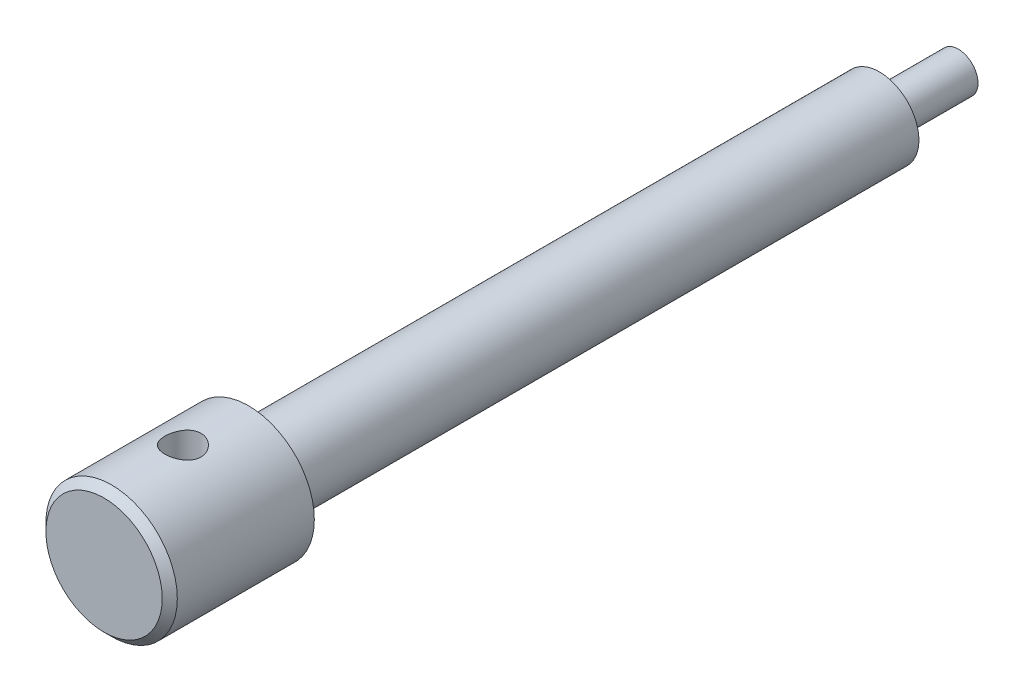
ISO-10303-21;
HEADER;
FILE_DESCRIPTION(('STEP AP214'),'2;1');
FILE_NAME('part.step','',(''),(''),'','','');
FILE_SCHEMA(('AUTOMOTIVE_DESIGN { 1 0 10303 214 1 1 1 1 }'));
ENDSEC;
DATA;
#1=APPLICATION_CONTEXT('core data for automotive mechanical design processes');
#2=APPLICATION_PROTOCOL_DEFINITION('international standard','automotive_design',2000,#1);
#3=PRODUCT_CONTEXT('',#1,'mechanical');
#4=PRODUCT('Part','Part','',(#3));
#5=PRODUCT_RELATED_PRODUCT_CATEGORY('part','',(#4));
#6=PRODUCT_DEFINITION_FORMATION('','',#4);
#7=PRODUCT_DEFINITION_CONTEXT('part definition',#1,'design');
#8=PRODUCT_DEFINITION('design','',#6,#7);
#9=PRODUCT_DEFINITION_SHAPE('','',#8);
#10=(LENGTH_UNIT() NAMED_UNIT(*) SI_UNIT(.MILLI.,.METRE.));
#11=(NAMED_UNIT(*) PLANE_ANGLE_UNIT() SI_UNIT($,.RADIAN.));
#12=(NAMED_UNIT(*) SI_UNIT($,.STERADIAN.) SOLID_ANGLE_UNIT());
#13=UNCERTAINTY_MEASURE_WITH_UNIT(LENGTH_MEASURE(1.E-05),#10,'distance_accuracy_value','');
#14=(GEOMETRIC_REPRESENTATION_CONTEXT(3) GLOBAL_UNCERTAINTY_ASSIGNED_CONTEXT((#13)) GLOBAL_UNIT_ASSIGNED_CONTEXT((#10,
#11,#12)) REPRESENTATION_CONTEXT('',''));
#15=CARTESIAN_POINT('',(0.,0.,0.));
#16=DIRECTION('',(0.,0.,1.));
#17=DIRECTION('',(1.,0.,0.));
#18=AXIS2_PLACEMENT_3D('',#15,#16,#17);
#19=CARTESIAN_POINT('',(0.,0.,-22.));
#20=DIRECTION('',(0.,0.,1.));
#21=DIRECTION('',(1.,0.,0.));
#22=AXIS2_PLACEMENT_3D('',#19,#20,#21);
#23=CYLINDRICAL_SURFACE('',#22,10.);
#24=CARTESIAN_POINT('',(0.,0.,-1.14999999999998));
#25=DIRECTION('',(0.,0.,1.));
#26=DIRECTION('',(1.,0.,0.));
#27=AXIS2_PLACEMENT_3D('',#24,#25,#26);
#28=CIRCLE('',#27,10.);
#29=CARTESIAN_POINT('',(10.,0.,-1.14999999999998));
#30=VERTEX_POINT('',#29);
#31=EDGE_CURVE('E10',#30,#30,#28,.F.);
#32=ORIENTED_EDGE('',*,*,#31,.T.);
#33=EDGE_LOOP('',(#32));
#34=FACE_BOUND('',#33,.T.);
#35=CARTESIAN_POINT('',(0.,-10.,-9.25));
#36=CARTESIAN_POINT('',(-0.15142288054616,-9.99999790513766,-9.25000321500592));
#37=CARTESIAN_POINT('',(-0.30287955595928,-9.99652704650772,-9.26254850145414));
#38=CARTESIAN_POINT('',(-0.601418354260669,-9.9830186270672,-9.31230216365556));
#39=CARTESIAN_POINT('',(-0.748498536656077,-9.97297819743096,-9.34952131418069));
#40=CARTESIAN_POINT('',(-1.03393279250043,-9.94743692261125,-9.44731247744151));
#41=CARTESIAN_POINT('',(-1.17229822737418,-9.93194336798913,-9.50785332037831));
#42=CARTESIAN_POINT('',(-1.43691255379179,-9.89712668345016,-9.65045078860279));
#43=CARTESIAN_POINT('',(-1.56316043555,-9.8778032347893,-9.73250920488028));
#44=CARTESIAN_POINT('',(-1.80305227968481,-9.83687707615023,-9.917936466711));
#45=CARTESIAN_POINT('',(-1.91635675585361,-9.81523348882718,-10.0217354929931));
#46=CARTESIAN_POINT('',(-2.12418937034499,-9.77236429681612,-10.2467786095008));
#47=CARTESIAN_POINT('',(-2.21871492536604,-9.75113874999667,-10.3680250959166));
#48=CARTESIAN_POINT('',(-2.3879928048007,-9.71108741535023,-10.6272699953001));
#49=CARTESIAN_POINT('',(-2.46234890182804,-9.69231302357291,-10.7655358044921));
#50=CARTESIAN_POINT('',(-2.58662289280498,-9.65989315157521,-11.0532068008113));
#51=CARTESIAN_POINT('',(-2.63654561269354,-9.64624665864575,-11.202609781466));
#52=CARTESIAN_POINT('',(-2.70934583339765,-9.62605068230367,-11.5045411062658));
#53=CARTESIAN_POINT('',(-2.73284141478253,-9.61933931887465,-11.6569093237221));
#54=CARTESIAN_POINT('',(-2.75404817777636,-9.61329031398856,-11.9635612268621));
#55=CARTESIAN_POINT('',(-2.75176451055439,-9.61395119941996,-12.1178445237233));
#56=CARTESIAN_POINT('',(-2.72196703105347,-9.62242747025718,-12.4190757478641));
#57=CARTESIAN_POINT('',(-2.69520726367137,-9.63002901969587,-12.5661052477844));
#58=CARTESIAN_POINT('',(-2.61842742838165,-9.65118687572159,-12.8535025714285));
#59=CARTESIAN_POINT('',(-2.56840539656606,-9.66474368507387,-12.9938698315922));
#60=CARTESIAN_POINT('',(-2.4459209567268,-9.6964683447985,-13.2658944108331));
#61=CARTESIAN_POINT('',(-2.37319900461751,-9.71468906347739,-13.3974284382204));
#62=CARTESIAN_POINT('',(-2.20755990360936,-9.75366083636266,-13.6466884827834));
#63=CARTESIAN_POINT('',(-2.11463855343105,-9.77441241656904,-13.7644116195729));
#64=CARTESIAN_POINT('',(-1.90740929772698,-9.81699239446061,-13.9870091466622));
#65=CARTESIAN_POINT('',(-1.79246989633679,-9.83883313993221,-14.0912941501466));
#66=CARTESIAN_POINT('',(-1.54646529022639,-9.88048509931731,-14.2792334861871));
#67=CARTESIAN_POINT('',(-1.41539936793062,-9.90029622284757,-14.3628869002094));
#68=CARTESIAN_POINT('',(-1.13991171237083,-9.93579173537182,-14.5074709694204));
#69=CARTESIAN_POINT('',(-0.99542816902353,-9.95145560173257,-14.5682892228292));
#70=CARTESIAN_POINT('',(-0.697756886739508,-9.97674362417589,-14.6645994988265));
#71=CARTESIAN_POINT('',(-0.544571183725094,-9.98636918666117,-14.7000974191275));
#72=CARTESIAN_POINT('',(-0.238869177115232,-9.9982810111614,-14.7438206524885));
#73=CARTESIAN_POINT('',(-0.0864756103297054,-10.000782674802,-14.7528466438887));
#74=CARTESIAN_POINT('',(0.217649807662516,-9.9987871538593,-14.7455888909791));
#75=CARTESIAN_POINT('',(0.369381730098336,-9.99429074228732,-14.7293079420889));
#76=CARTESIAN_POINT('',(0.664979617013325,-9.97894393202139,-14.6725532308625));
#77=CARTESIAN_POINT('',(0.808939039798371,-9.9682122412504,-14.6325311636914));
#78=CARTESIAN_POINT('',(1.0880827793532,-9.94161719611215,-14.5299593417987));
#79=CARTESIAN_POINT('',(1.22326611385297,-9.92575326850046,-14.4674070704807));
#80=CARTESIAN_POINT('',(1.48409215986275,-9.8901549618779,-14.3200996389175));
#81=CARTESIAN_POINT('',(1.60948250607276,-9.8703479114638,-14.2349156438466));
#82=CARTESIAN_POINT('',(1.84446827852135,-9.82915015297009,-14.0452974327971));
#83=CARTESIAN_POINT('',(1.95406037181207,-9.80775911215361,-13.9408591653165));
#84=CARTESIAN_POINT('',(2.15775026201618,-9.7650031873956,-13.7119525791631));
#85=CARTESIAN_POINT('',(2.251281730008,-9.74365851048396,-13.5869755682236));
#86=CARTESIAN_POINT('',(2.41606367483463,-9.70411480368906,-13.3226441444321));
#87=CARTESIAN_POINT('',(2.48731502634094,-9.68591565033158,-13.183290296271));
#88=CARTESIAN_POINT('',(2.60498194683926,-9.65493519387949,-12.8948127830444));
#89=CARTESIAN_POINT('',(2.65153712112234,-9.64212352305557,-12.7457495020344));
#90=CARTESIAN_POINT('',(2.71879365333576,-9.62337795912282,-12.4414941043237));
#91=CARTESIAN_POINT('',(2.73950213610858,-9.61744217065575,-12.2863036887896));
#92=CARTESIAN_POINT('',(2.75404886250929,-9.6132857915914,-11.9800168619441));
#93=CARTESIAN_POINT('',(2.7488002394832,-9.614803002412,-11.8289667485267));
#94=CARTESIAN_POINT('',(2.71371466404338,-9.62476380479946,-11.5299943066319));
#95=CARTESIAN_POINT('',(2.6838784224126,-9.63320719614311,-11.3820718878654));
#96=CARTESIAN_POINT('',(2.60100915929162,-9.65590796713358,-11.0947850377666));
#97=CARTESIAN_POINT('',(2.54818121034424,-9.67011387408798,-10.955357095575));
#98=CARTESIAN_POINT('',(2.4209868326845,-9.70273746413612,-10.6872356500162));
#99=CARTESIAN_POINT('',(2.34661683356165,-9.72115584530486,-10.5585439306439));
#100=CARTESIAN_POINT('',(2.17573113118099,-9.76084545820376,-10.31121804491));
#101=CARTESIAN_POINT('',(2.07859788342802,-9.78218767167194,-10.1930219082836));
#102=CARTESIAN_POINT('',(1.86610223089928,-9.82493707924126,-9.97431048146074));
#103=CARTESIAN_POINT('',(1.75073533607713,-9.84634428807069,-9.87379955917612));
#104=CARTESIAN_POINT('',(1.50182041708214,-9.88740569602886,-9.69101234570102));
#105=CARTESIAN_POINT('',(1.36791284853874,-9.907007737952,-9.60921290648396));
#106=CARTESIAN_POINT('',(1.08770978773099,-9.94166772298476,-9.46941355547849));
#107=CARTESIAN_POINT('',(0.941421808208406,-9.95672839694538,-9.41139933339713));
#108=CARTESIAN_POINT('',(0.663199431238339,-9.97880995779365,-9.3278272791417));
#109=CARTESIAN_POINT('',(0.532391527581486,-9.9866965174671,-9.29871242008099));
#110=CARTESIAN_POINT('',(0.267730991455101,-9.9972921723884,-9.25979844958546));
#111=CARTESIAN_POINT('',(0.13387870444774,-10.0000018521471,-9.24999715749148));
#112=CARTESIAN_POINT('',(0.,-10.,-9.25));
#113=B_SPLINE_CURVE_WITH_KNOTS('',3,(#35,#36,#37,#38,#39,#40,#41,#42,#43,#44,#45,#46,#47,#48,
#49,#50,#51,#52,#53,#54,#55,#56,#57,#58,#59,#60,#61,#62,#63,#64,#65,#66,#67,#68,#69,#70,#71,#72,
#73,#74,#75,#76,#77,#78,#79,#80,#81,#82,#83,#84,#85,#86,#87,#88,#89,#90,#91,#92,#93,#94,#95,#96,
#97,#98,#99,#100,#101,#102,#103,#104,#105,#106,#107,#108,#109,#110,#111,#112),.UNSPECIFIED.,.T.,
.F.,(4,2,2,2,2,2,2,2,2,2,2,2,2,2,2,2,2,2,2,2,2,2,2,2,2,2,2,2,2,2,2,2,2,2,2,2,2,2,4),(0.,
0.45377748539177,0.907753260457005,1.36112438331929,1.81453325397615,2.27794447457157,
2.74141939974404,3.21343018374437,3.68534770125013,4.14598225260575,4.60652476231645,
5.0533402259908,5.50019341874362,5.9523554849122,6.40461168655381,6.87259959045547,
7.34060832576983,7.81089145054107,8.28106499929747,8.73686293716824,9.19261053090921,
9.63995333728771,10.0873461268162,10.5439096300483,11.0005693136824,11.4709880754159,
11.9413883671581,12.4091004005343,12.8766834769387,13.3279371425805,13.7791777637644,
14.2264735227925,14.6738434597267,15.1351456160056,15.5965615457126,16.0686764715747,
16.5405069328285,16.9417541030026,17.3429559665035),.UNSPECIFIED.);
#114=CARTESIAN_POINT('',(0.,-10.,-9.25));
#115=VERTEX_POINT('',#114);
#116=EDGE_CURVE('E59',#115,#115,#113,.T.);
#117=ORIENTED_EDGE('',*,*,#116,.F.);
#118=EDGE_LOOP('',(#117));
#119=FACE_BOUND('',#118,.T.);
#120=CARTESIAN_POINT('',(0.,10.,-9.25));
#121=CARTESIAN_POINT('',(0.15142288054616,9.99999790513766,-9.25000321500592));
#122=CARTESIAN_POINT('',(0.30287955595928,9.99652704650772,-9.26254850145414));
#123=CARTESIAN_POINT('',(0.601418354260669,9.9830186270672,-9.31230216365556));
#124=CARTESIAN_POINT('',(0.748498536656077,9.97297819743096,-9.34952131418069));
#125=CARTESIAN_POINT('',(1.03393279250043,9.94743692261125,-9.44731247744151));
#126=CARTESIAN_POINT('',(1.17229822737418,9.93194336798913,-9.50785332037831));
#127=CARTESIAN_POINT('',(1.43691255379179,9.89712668345016,-9.65045078860279));
#128=CARTESIAN_POINT('',(1.56316043555,9.8778032347893,-9.73250920488028));
#129=CARTESIAN_POINT('',(1.80305227968481,9.83687707615023,-9.917936466711));
#130=CARTESIAN_POINT('',(1.91635675585361,9.81523348882718,-10.0217354929931));
#131=CARTESIAN_POINT('',(2.12418937034499,9.77236429681612,-10.2467786095008));
#132=CARTESIAN_POINT('',(2.21871492536604,9.75113874999667,-10.3680250959166));
#133=CARTESIAN_POINT('',(2.3879928048007,9.71108741535023,-10.6272699953001));
#134=CARTESIAN_POINT('',(2.46234890182804,9.69231302357291,-10.7655358044921));
#135=CARTESIAN_POINT('',(2.58662289280498,9.65989315157521,-11.0532068008113));
#136=CARTESIAN_POINT('',(2.63654561269354,9.64624665864575,-11.202609781466));
#137=CARTESIAN_POINT('',(2.70934583339765,9.62605068230367,-11.5045411062658));
#138=CARTESIAN_POINT('',(2.73284141478253,9.61933931887465,-11.6569093237221));
#139=CARTESIAN_POINT('',(2.75404817777636,9.61329031398856,-11.9635612268621));
#140=CARTESIAN_POINT('',(2.75176451055439,9.61395119941996,-12.1178445237233));
#141=CARTESIAN_POINT('',(2.72196703105347,9.62242747025718,-12.4190757478641));
#142=CARTESIAN_POINT('',(2.69520726367137,9.63002901969587,-12.5661052477844));
#143=CARTESIAN_POINT('',(2.61842742838165,9.65118687572159,-12.8535025714285));
#144=CARTESIAN_POINT('',(2.56840539656606,9.66474368507387,-12.9938698315922));
#145=CARTESIAN_POINT('',(2.4459209567268,9.6964683447985,-13.2658944108331));
#146=CARTESIAN_POINT('',(2.37319900461751,9.71468906347739,-13.3974284382204));
#147=CARTESIAN_POINT('',(2.20755990360936,9.75366083636266,-13.6466884827834));
#148=CARTESIAN_POINT('',(2.11463855343105,9.77441241656904,-13.7644116195729));
#149=CARTESIAN_POINT('',(1.90740929772698,9.81699239446061,-13.9870091466622));
#150=CARTESIAN_POINT('',(1.79246989633679,9.83883313993221,-14.0912941501466));
#151=CARTESIAN_POINT('',(1.54646529022639,9.88048509931731,-14.2792334861871));
#152=CARTESIAN_POINT('',(1.41539936793062,9.90029622284757,-14.3628869002094));
#153=CARTESIAN_POINT('',(1.13991171237083,9.93579173537182,-14.5074709694204));
#154=CARTESIAN_POINT('',(0.99542816902353,9.95145560173257,-14.5682892228292));
#155=CARTESIAN_POINT('',(0.697756886739508,9.97674362417589,-14.6645994988265));
#156=CARTESIAN_POINT('',(0.544571183725094,9.98636918666117,-14.7000974191275));
#157=CARTESIAN_POINT('',(0.238869177115232,9.9982810111614,-14.7438206524885));
#158=CARTESIAN_POINT('',(0.0864756103297054,10.000782674802,-14.7528466438887));
#159=CARTESIAN_POINT('',(-0.217649807662516,9.9987871538593,-14.7455888909791));
#160=CARTESIAN_POINT('',(-0.369381730098336,9.99429074228732,-14.7293079420889));
#161=CARTESIAN_POINT('',(-0.664979617013325,9.97894393202139,-14.6725532308625));
#162=CARTESIAN_POINT('',(-0.808939039798371,9.9682122412504,-14.6325311636914));
#163=CARTESIAN_POINT('',(-1.0880827793532,9.94161719611215,-14.5299593417987));
#164=CARTESIAN_POINT('',(-1.22326611385297,9.92575326850046,-14.4674070704807));
#165=CARTESIAN_POINT('',(-1.48409215986275,9.8901549618779,-14.3200996389175));
#166=CARTESIAN_POINT('',(-1.60948250607276,9.8703479114638,-14.2349156438466));
#167=CARTESIAN_POINT('',(-1.84446827852135,9.82915015297009,-14.0452974327971));
#168=CARTESIAN_POINT('',(-1.95406037181207,9.80775911215361,-13.9408591653165));
#169=CARTESIAN_POINT('',(-2.15775026201618,9.7650031873956,-13.7119525791631));
#170=CARTESIAN_POINT('',(-2.251281730008,9.74365851048396,-13.5869755682236));
#171=CARTESIAN_POINT('',(-2.41606367483463,9.70411480368906,-13.3226441444321));
#172=CARTESIAN_POINT('',(-2.48731502634094,9.68591565033158,-13.183290296271));
#173=CARTESIAN_POINT('',(-2.60498194683926,9.65493519387949,-12.8948127830444));
#174=CARTESIAN_POINT('',(-2.65153712112234,9.64212352305557,-12.7457495020344));
#175=CARTESIAN_POINT('',(-2.71879365333576,9.62337795912282,-12.4414941043237));
#176=CARTESIAN_POINT('',(-2.73950213610858,9.61744217065575,-12.2863036887896));
#177=CARTESIAN_POINT('',(-2.75404886250929,9.6132857915914,-11.9800168619441));
#178=CARTESIAN_POINT('',(-2.7488002394832,9.614803002412,-11.8289667485267));
#179=CARTESIAN_POINT('',(-2.71371466404338,9.62476380479946,-11.5299943066319));
#180=CARTESIAN_POINT('',(-2.6838784224126,9.63320719614311,-11.3820718878654));
#181=CARTESIAN_POINT('',(-2.60100915929162,9.65590796713358,-11.0947850377666));
#182=CARTESIAN_POINT('',(-2.54818121034424,9.67011387408798,-10.955357095575));
#183=CARTESIAN_POINT('',(-2.4209868326845,9.70273746413612,-10.6872356500162));
#184=CARTESIAN_POINT('',(-2.34661683356165,9.72115584530486,-10.5585439306439));
#185=CARTESIAN_POINT('',(-2.17573113118099,9.76084545820376,-10.31121804491));
#186=CARTESIAN_POINT('',(-2.07859788342802,9.78218767167194,-10.1930219082836));
#187=CARTESIAN_POINT('',(-1.86610223089928,9.82493707924126,-9.97431048146074));
#188=CARTESIAN_POINT('',(-1.75073533607713,9.84634428807069,-9.87379955917612));
#189=CARTESIAN_POINT('',(-1.50182041708214,9.88740569602886,-9.69101234570102));
#190=CARTESIAN_POINT('',(-1.36791284853874,9.907007737952,-9.60921290648396));
#191=CARTESIAN_POINT('',(-1.08770978773099,9.94166772298476,-9.46941355547849));
#192=CARTESIAN_POINT('',(-0.941421808208406,9.95672839694538,-9.41139933339713));
#193=CARTESIAN_POINT('',(-0.663199431238339,9.97880995779365,-9.3278272791417));
#194=CARTESIAN_POINT('',(-0.532391527581486,9.9866965174671,-9.29871242008099));
#195=CARTESIAN_POINT('',(-0.267730991455101,9.9972921723884,-9.25979844958546));
#196=CARTESIAN_POINT('',(-0.13387870444774,10.0000018521471,-9.24999715749148));
#197=CARTESIAN_POINT('',(0.,10.,-9.25));
#198=B_SPLINE_CURVE_WITH_KNOTS('',3,(#120,#121,#122,#123,#124,#125,#126,#127,#128,#129,#130,
#131,#132,#133,#134,#135,#136,#137,#138,#139,#140,#141,#142,#143,#144,#145,#146,#147,#148,#149,
#150,#151,#152,#153,#154,#155,#156,#157,#158,#159,#160,#161,#162,#163,#164,#165,#166,#167,#168,
#169,#170,#171,#172,#173,#174,#175,#176,#177,#178,#179,#180,#181,#182,#183,#184,#185,#186,#187,
#188,#189,#190,#191,#192,#193,#194,#195,#196,#197),.UNSPECIFIED.,.T.,.F.,(4,2,2,2,2,2,2,2,2,2,2,
2,2,2,2,2,2,2,2,2,2,2,2,2,2,2,2,2,2,2,2,2,2,2,2,2,2,2,4),(0.,0.45377748539177,0.907753260457005,
1.36112438331929,1.81453325397615,2.27794447457157,2.74141939974404,3.21343018374437,
3.68534770125013,4.14598225260575,4.60652476231645,5.0533402259908,5.50019341874362,
5.9523554849122,6.40461168655381,6.87259959045547,7.34060832576983,7.81089145054107,
8.28106499929747,8.73686293716824,9.19261053090921,9.63995333728771,10.0873461268162,
10.5439096300483,11.0005693136824,11.4709880754159,11.9413883671581,12.4091004005343,
12.8766834769387,13.3279371425805,13.7791777637644,14.2264735227925,14.6738434597267,
15.1351456160056,15.5965615457126,16.0686764715747,16.5405069328285,16.9417541030026,
17.3429559665035),.UNSPECIFIED.);
#199=CARTESIAN_POINT('',(0.,10.,-9.25));
#200=VERTEX_POINT('',#199);
#201=EDGE_CURVE('E64',#200,#200,#198,.T.);
#202=ORIENTED_EDGE('',*,*,#201,.F.);
#203=EDGE_LOOP('',(#202));
#204=FACE_BOUND('',#203,.T.);
#205=CARTESIAN_POINT('',(0.,0.,-22.));
#206=DIRECTION('',(0.,0.,1.));
#207=DIRECTION('',(1.,0.,0.));
#208=AXIS2_PLACEMENT_3D('',#205,#206,#207);
#209=CIRCLE('',#208,10.);
#210=CARTESIAN_POINT('',(10.,0.,-22.));
#211=VERTEX_POINT('',#210);
#212=EDGE_CURVE('E117',#211,#211,#209,.T.);
#213=ORIENTED_EDGE('',*,*,#212,.T.);
#214=EDGE_LOOP('',(#213));
#215=FACE_BOUND('',#214,.T.);
#216=ADVANCED_FACE('F45',(#34,#119,#204,#215),#23,.T.);
#217=CARTESIAN_POINT('',(0.,0.,-22.));
#218=DIRECTION('',(0.,0.,1.));
#219=DIRECTION('',(1.,0.,0.));
#220=AXIS2_PLACEMENT_3D('',#217,#218,#219);
#221=PLANE('',#220);
#222=CARTESIAN_POINT('',(0.,0.,-22.));
#223=DIRECTION('',(0.,0.,-1.));
#224=DIRECTION('',(-1.,0.,0.));
#225=AXIS2_PLACEMENT_3D('',#222,#223,#224);
#226=CIRCLE('',#225,6.);
#227=CARTESIAN_POINT('',(-6.,0.,-22.));
#228=VERTEX_POINT('',#227);
#229=EDGE_CURVE('E120',#228,#228,#226,.T.);
#230=ORIENTED_EDGE('',*,*,#229,.F.);
#231=EDGE_LOOP('',(#230));
#232=FACE_BOUND('',#231,.T.);
#233=ORIENTED_EDGE('',*,*,#212,.F.);
#234=EDGE_LOOP('',(#233));
#235=FACE_BOUND('',#234,.T.);
#236=ADVANCED_FACE('F100',(#232,#235),#221,.F.);
#237=CARTESIAN_POINT('',(0.,0.,0.));
#238=DIRECTION('',(0.,0.,1.));
#239=DIRECTION('',(1.,0.,0.));
#240=AXIS2_PLACEMENT_3D('',#237,#238,#239);
#241=PLANE('',#240);
#242=CARTESIAN_POINT('',(0.,0.,0.));
#243=DIRECTION('',(0.,0.,1.));
#244=DIRECTION('',(1.,0.,0.));
#245=AXIS2_PLACEMENT_3D('',#242,#243,#244);
#246=CIRCLE('',#245,8.85000000000001);
#247=CARTESIAN_POINT('',(8.85000000000001,0.,0.));
#248=VERTEX_POINT('',#247);
#249=EDGE_CURVE('E54',#248,#248,#246,.T.);
#250=ORIENTED_EDGE('',*,*,#249,.T.);
#251=EDGE_LOOP('',(#250));
#252=FACE_BOUND('',#251,.T.);
#253=ADVANCED_FACE('F98',(#252),#241,.T.);
#254=CARTESIAN_POINT('',(0.,0.,-118.));
#255=DIRECTION('',(0.,0.,1.));
#256=DIRECTION('',(1.,0.,0.));
#257=AXIS2_PLACEMENT_3D('',#254,#255,#256);
#258=CYLINDRICAL_SURFACE('',#257,6.);
#259=CARTESIAN_POINT('',(0.,0.,-118.));
#260=DIRECTION('',(0.,0.,-1.));
#261=DIRECTION('',(-1.,0.,0.));
#262=AXIS2_PLACEMENT_3D('',#259,#260,#261);
#263=CIRCLE('',#262,6.);
#264=CARTESIAN_POINT('',(-6.,0.,-118.));
#265=VERTEX_POINT('',#264);
#266=EDGE_CURVE('E121',#265,#265,#263,.T.);
#267=ORIENTED_EDGE('',*,*,#266,.F.);
#268=EDGE_LOOP('',(#267));
#269=FACE_BOUND('',#268,.T.);
#270=ORIENTED_EDGE('',*,*,#229,.T.);
#271=EDGE_LOOP('',(#270));
#272=FACE_BOUND('',#271,.T.);
#273=ADVANCED_FACE('F94',(#269,#272),#258,.T.);
#274=CARTESIAN_POINT('',(0.,0.,-118.));
#275=DIRECTION('',(0.,0.,-1.));
#276=DIRECTION('',(-1.,0.,0.));
#277=AXIS2_PLACEMENT_3D('',#274,#275,#276);
#278=PLANE('',#277);
#279=CARTESIAN_POINT('',(0.,0.,-118.));
#280=DIRECTION('',(0.,0.,-1.));
#281=DIRECTION('',(-1.,0.,0.));
#282=AXIS2_PLACEMENT_3D('',#279,#280,#281);
#283=CIRCLE('',#282,3.);
#284=CARTESIAN_POINT('',(-3.,0.,-118.));
#285=VERTEX_POINT('',#284);
#286=EDGE_CURVE('E125',#285,#285,#283,.T.);
#287=ORIENTED_EDGE('',*,*,#286,.F.);
#288=EDGE_LOOP('',(#287));
#289=FACE_BOUND('',#288,.T.);
#290=ORIENTED_EDGE('',*,*,#266,.T.);
#291=EDGE_LOOP('',(#290));
#292=FACE_BOUND('',#291,.T.);
#293=ADVANCED_FACE('F90',(#289,#292),#278,.T.);
#294=CARTESIAN_POINT('',(0.,0.,-130.));
#295=DIRECTION('',(0.,0.,1.));
#296=DIRECTION('',(1.,0.,0.));
#297=AXIS2_PLACEMENT_3D('',#294,#295,#296);
#298=CYLINDRICAL_SURFACE('',#297,3.);
#299=CARTESIAN_POINT('',(0.,0.,-130.));
#300=DIRECTION('',(0.,0.,-1.));
#301=DIRECTION('',(-1.,0.,0.));
#302=AXIS2_PLACEMENT_3D('',#299,#300,#301);
#303=CIRCLE('',#302,3.);
#304=CARTESIAN_POINT('',(-3.,0.,-130.));
#305=VERTEX_POINT('',#304);
#306=EDGE_CURVE('E128',#305,#305,#303,.T.);
#307=ORIENTED_EDGE('',*,*,#306,.F.);
#308=EDGE_LOOP('',(#307));
#309=FACE_BOUND('',#308,.T.);
#310=ORIENTED_EDGE('',*,*,#286,.T.);
#311=EDGE_LOOP('',(#310));
#312=FACE_BOUND('',#311,.T.);
#313=ADVANCED_FACE('F86',(#309,#312),#298,.T.);
#314=CARTESIAN_POINT('',(0.,0.,-130.));
#315=DIRECTION('',(0.,0.,-1.));
#316=DIRECTION('',(-1.,0.,0.));
#317=AXIS2_PLACEMENT_3D('',#314,#315,#316);
#318=PLANE('',#317);
#319=ORIENTED_EDGE('',*,*,#306,.T.);
#320=EDGE_LOOP('',(#319));
#321=FACE_BOUND('',#320,.T.);
#322=ADVANCED_FACE('F81',(#321),#318,.T.);
#323=CARTESIAN_POINT('',(0.,-10.,-12.));
#324=DIRECTION('',(0.,1.,0.));
#325=DIRECTION('',(0.,0.,1.));
#326=AXIS2_PLACEMENT_3D('',#323,#324,#325);
#327=CYLINDRICAL_SURFACE('',#326,2.75);
#328=ORIENTED_EDGE('',*,*,#116,.T.);
#329=EDGE_LOOP('',(#328));
#330=FACE_BOUND('',#329,.T.);
#331=ORIENTED_EDGE('',*,*,#201,.T.);
#332=EDGE_LOOP('',(#331));
#333=FACE_BOUND('',#332,.T.);
#334=ADVANCED_FACE('F77',(#330,#333),#327,.F.);
#335=CARTESIAN_POINT('',(0.,0.,0.));
#336=DIRECTION('',(0.,0.,-1.));
#337=DIRECTION('',(-1.,0.,0.));
#338=AXIS2_PLACEMENT_3D('',#335,#336,#337);
#339=CONICAL_SURFACE('',#338,8.85000000000001,0.78539816339745);
#340=ORIENTED_EDGE('',*,*,#31,.F.);
#341=EDGE_LOOP('',(#340));
#342=FACE_BOUND('',#341,.T.);
#343=ORIENTED_EDGE('',*,*,#249,.F.);
#344=EDGE_LOOP('',(#343));
#345=FACE_BOUND('',#344,.T.);
#346=ADVANCED_FACE('F48',(#342,#345),#339,.T.);
#347=CLOSED_SHELL('',(#216,#236,#253,#273,#293,#313,#322,#334,#346));
#348=MANIFOLD_SOLID_BREP('B2',#347);
#349=ADVANCED_BREP_SHAPE_REPRESENTATION('',(#18,#348),#14);
#350=SHAPE_DEFINITION_REPRESENTATION(#9,#349);
ENDSEC;
END-ISO-10303-21;
